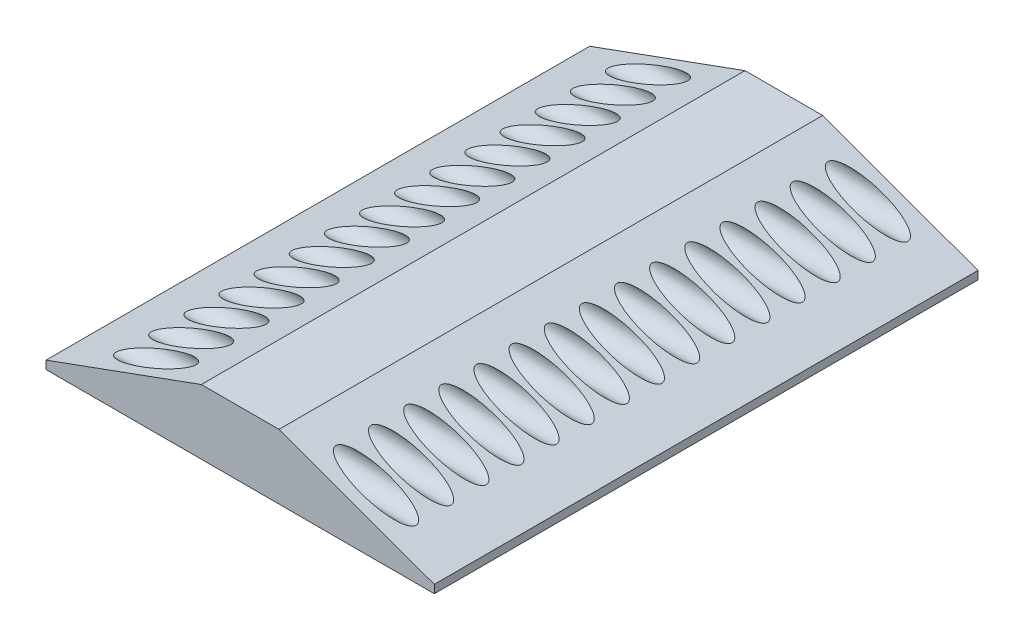
ISO-10303-21;
HEADER;
FILE_DESCRIPTION(('STEP AP214'),'2;1');
FILE_NAME('part.step','',(''),(''),'','','');
FILE_SCHEMA(('AUTOMOTIVE_DESIGN { 1 0 10303 214 1 1 1 1 }'));
ENDSEC;
DATA;
#1=APPLICATION_CONTEXT('core data for automotive mechanical design processes');
#2=APPLICATION_PROTOCOL_DEFINITION('international standard','automotive_design',2000,#1);
#3=PRODUCT_CONTEXT('',#1,'mechanical');
#4=PRODUCT('Part','Part','',(#3));
#5=PRODUCT_RELATED_PRODUCT_CATEGORY('part','',(#4));
#6=PRODUCT_DEFINITION_FORMATION('','',#4);
#7=PRODUCT_DEFINITION_CONTEXT('part definition',#1,'design');
#8=PRODUCT_DEFINITION('design','',#6,#7);
#9=PRODUCT_DEFINITION_SHAPE('','',#8);
#10=(LENGTH_UNIT() NAMED_UNIT(*) SI_UNIT(.MILLI.,.METRE.));
#11=(NAMED_UNIT(*) PLANE_ANGLE_UNIT() SI_UNIT($,.RADIAN.));
#12=(NAMED_UNIT(*) SI_UNIT($,.STERADIAN.) SOLID_ANGLE_UNIT());
#13=UNCERTAINTY_MEASURE_WITH_UNIT(LENGTH_MEASURE(1.E-05),#10,'distance_accuracy_value','');
#14=(GEOMETRIC_REPRESENTATION_CONTEXT(3) GLOBAL_UNCERTAINTY_ASSIGNED_CONTEXT((#13)) GLOBAL_UNIT_ASSIGNED_CONTEXT((#10,
#11,#12)) REPRESENTATION_CONTEXT('',''));
#15=CARTESIAN_POINT('',(0.,0.,0.));
#16=DIRECTION('',(0.,0.,1.));
#17=DIRECTION('',(1.,0.,0.));
#18=AXIS2_PLACEMENT_3D('',#15,#16,#17);
#19=CARTESIAN_POINT('',(15.,5.,21.));
#20=DIRECTION('',(-1.,0.,0.));
#21=DIRECTION('',(0.,0.,1.));
#22=AXIS2_PLACEMENT_3D('',#19,#20,#21);
#23=PLANE('',#22);
#24=DIRECTION('',(0.,-1.,0.));
#25=VECTOR('',#24,1.);
#26=CARTESIAN_POINT('',(15.,5.,-21.));
#27=LINE('',#26,#25);
#28=CARTESIAN_POINT('',(15.,0.632357188805568,-21.));
#29=VERTEX_POINT('',#28);
#30=CARTESIAN_POINT('',(15.,0.,-21.));
#31=VERTEX_POINT('',#30);
#32=EDGE_CURVE('E86',#29,#31,#27,.T.);
#33=ORIENTED_EDGE('',*,*,#32,.F.);
#34=DIRECTION('',(0.,0.,1.));
#35=VECTOR('',#34,1.);
#36=CARTESIAN_POINT('',(15.,0.632357188805568,21.));
#37=LINE('',#36,#35);
#38=CARTESIAN_POINT('',(15.,0.632357188805568,21.));
#39=VERTEX_POINT('',#38);
#40=EDGE_CURVE('E128',#29,#39,#37,.T.);
#41=ORIENTED_EDGE('',*,*,#40,.T.);
#42=DIRECTION('',(0.,-1.,0.));
#43=VECTOR('',#42,1.);
#44=CARTESIAN_POINT('',(15.,5.,21.));
#45=LINE('',#44,#43);
#46=CARTESIAN_POINT('',(15.,0.,21.));
#47=VERTEX_POINT('',#46);
#48=EDGE_CURVE('E108',#39,#47,#45,.T.);
#49=ORIENTED_EDGE('',*,*,#48,.T.);
#50=DIRECTION('',(0.,0.,-1.));
#51=VECTOR('',#50,1.);
#52=CARTESIAN_POINT('',(15.,0.,21.));
#53=LINE('',#52,#51);
#54=EDGE_CURVE('E103',#47,#31,#53,.T.);
#55=ORIENTED_EDGE('',*,*,#54,.T.);
#56=EDGE_LOOP('',(#33,#41,#49,#55));
#57=FACE_BOUND('',#56,.T.);
#58=ADVANCED_FACE('F33',(#57),#23,.F.);
#59=CARTESIAN_POINT('',(-15.,5.,-21.));
#60=DIRECTION('',(0.,0.,1.));
#61=DIRECTION('',(1.,0.,0.));
#62=AXIS2_PLACEMENT_3D('',#59,#60,#61);
#63=PLANE('',#62);
#64=DIRECTION('',(0.,-1.,0.));
#65=VECTOR('',#64,1.);
#66=CARTESIAN_POINT('',(-15.,5.,-21.));
#67=LINE('',#66,#65);
#68=CARTESIAN_POINT('',(-15.,0.632357188805568,-21.));
#69=VERTEX_POINT('',#68);
#70=CARTESIAN_POINT('',(-15.,0.,-21.));
#71=VERTEX_POINT('',#70);
#72=EDGE_CURVE('E97',#69,#71,#67,.T.);
#73=ORIENTED_EDGE('',*,*,#72,.F.);
#74=DIRECTION('',(-0.939692620785909,-0.342020143325666,0.));
#75=VECTOR('',#74,1.);
#76=CARTESIAN_POINT('',(-2.99999999999991,5.,-21.));
#77=LINE('',#76,#75);
#78=CARTESIAN_POINT('',(-2.99999999999991,5.,-21.));
#79=VERTEX_POINT('',#78);
#80=EDGE_CURVE('E11',#69,#79,#77,.F.);
#81=ORIENTED_EDGE('',*,*,#80,.T.);
#82=DIRECTION('',(-1.,0.,0.));
#83=VECTOR('',#82,1.);
#84=CARTESIAN_POINT('',(-15.,5.,-21.));
#85=LINE('',#84,#83);
#86=CARTESIAN_POINT('',(2.99999999999988,5.,-21.));
#87=VERTEX_POINT('',#86);
#88=EDGE_CURVE('E120',#87,#79,#85,.T.);
#89=ORIENTED_EDGE('',*,*,#88,.F.);
#90=DIRECTION('',(-0.939692620785909,0.342020143325666,0.));
#91=VECTOR('',#90,1.);
#92=CARTESIAN_POINT('',(2.99999999999988,5.,-21.));
#93=LINE('',#92,#91);
#94=EDGE_CURVE('E92',#87,#29,#93,.F.);
#95=ORIENTED_EDGE('',*,*,#94,.T.);
#96=ORIENTED_EDGE('',*,*,#32,.T.);
#97=DIRECTION('',(-1.,0.,0.));
#98=VECTOR('',#97,1.);
#99=CARTESIAN_POINT('',(-15.,0.,-21.));
#100=LINE('',#99,#98);
#101=EDGE_CURVE('E89',#31,#71,#100,.T.);
#102=ORIENTED_EDGE('',*,*,#101,.T.);
#103=EDGE_LOOP('',(#73,#81,#89,#95,#96,#102));
#104=FACE_BOUND('',#103,.T.);
#105=ADVANCED_FACE('F88',(#104),#63,.F.);
#106=CARTESIAN_POINT('',(-15.,5.,21.));
#107=DIRECTION('',(1.,0.,0.));
#108=DIRECTION('',(0.,0.,-1.));
#109=AXIS2_PLACEMENT_3D('',#106,#107,#108);
#110=PLANE('',#109);
#111=DIRECTION('',(0.,-1.,0.));
#112=VECTOR('',#111,1.);
#113=CARTESIAN_POINT('',(-15.,5.,21.));
#114=LINE('',#113,#112);
#115=CARTESIAN_POINT('',(-15.,0.632357188805568,21.));
#116=VERTEX_POINT('',#115);
#117=CARTESIAN_POINT('',(-15.,0.,21.));
#118=VERTEX_POINT('',#117);
#119=EDGE_CURVE('E122',#116,#118,#114,.T.);
#120=ORIENTED_EDGE('',*,*,#119,.F.);
#121=DIRECTION('',(0.,0.,-1.));
#122=VECTOR('',#121,1.);
#123=CARTESIAN_POINT('',(-15.,0.632357188805568,21.));
#124=LINE('',#123,#122);
#125=EDGE_CURVE('E42',#116,#69,#124,.T.);
#126=ORIENTED_EDGE('',*,*,#125,.T.);
#127=ORIENTED_EDGE('',*,*,#72,.T.);
#128=DIRECTION('',(0.,0.,1.));
#129=VECTOR('',#128,1.);
#130=CARTESIAN_POINT('',(-15.,0.,21.));
#131=LINE('',#130,#129);
#132=EDGE_CURVE('E105',#71,#118,#131,.T.);
#133=ORIENTED_EDGE('',*,*,#132,.T.);
#134=EDGE_LOOP('',(#120,#126,#127,#133));
#135=FACE_BOUND('',#134,.T.);
#136=ADVANCED_FACE('F251',(#135),#110,.F.);
#137=CARTESIAN_POINT('',(-15.,5.,21.));
#138=DIRECTION('',(0.,0.,-1.));
#139=DIRECTION('',(-1.,0.,0.));
#140=AXIS2_PLACEMENT_3D('',#137,#138,#139);
#141=PLANE('',#140);
#142=DIRECTION('',(1.,0.,0.));
#143=VECTOR('',#142,1.);
#144=CARTESIAN_POINT('',(-15.,5.,21.));
#145=LINE('',#144,#143);
#146=CARTESIAN_POINT('',(-2.99999999999991,5.,21.));
#147=VERTEX_POINT('',#146);
#148=CARTESIAN_POINT('',(2.99999999999988,5.,21.));
#149=VERTEX_POINT('',#148);
#150=EDGE_CURVE('E114',#147,#149,#145,.T.);
#151=ORIENTED_EDGE('',*,*,#150,.F.);
#152=DIRECTION('',(0.939692620785909,0.342020143325666,0.));
#153=VECTOR('',#152,1.);
#154=CARTESIAN_POINT('',(-2.99999999999991,5.,21.));
#155=LINE('',#154,#153);
#156=EDGE_CURVE('E57',#147,#116,#155,.F.);
#157=ORIENTED_EDGE('',*,*,#156,.T.);
#158=ORIENTED_EDGE('',*,*,#119,.T.);
#159=DIRECTION('',(1.,0.,0.));
#160=VECTOR('',#159,1.);
#161=CARTESIAN_POINT('',(-15.,0.,21.));
#162=LINE('',#161,#160);
#163=EDGE_CURVE('E118',#118,#47,#162,.T.);
#164=ORIENTED_EDGE('',*,*,#163,.T.);
#165=ORIENTED_EDGE('',*,*,#48,.F.);
#166=DIRECTION('',(0.939692620785909,-0.342020143325666,0.));
#167=VECTOR('',#166,1.);
#168=CARTESIAN_POINT('',(2.99999999999988,5.,21.));
#169=LINE('',#168,#167);
#170=EDGE_CURVE('E130',#39,#149,#169,.F.);
#171=ORIENTED_EDGE('',*,*,#170,.T.);
#172=EDGE_LOOP('',(#151,#157,#158,#164,#165,#171));
#173=FACE_BOUND('',#172,.T.);
#174=ADVANCED_FACE('F256',(#173),#141,.F.);
#175=CARTESIAN_POINT('',(0.,5.,0.));
#176=DIRECTION('',(0.,-1.,0.));
#177=DIRECTION('',(0.,0.,-1.));
#178=AXIS2_PLACEMENT_3D('',#175,#176,#177);
#179=PLANE('',#178);
#180=ORIENTED_EDGE('',*,*,#88,.T.);
#181=DIRECTION('',(0.,0.,1.));
#182=VECTOR('',#181,1.);
#183=CARTESIAN_POINT('',(-2.99999999999991,5.,0.));
#184=LINE('',#183,#182);
#185=EDGE_CURVE('E133',#79,#147,#184,.T.);
#186=ORIENTED_EDGE('',*,*,#185,.T.);
#187=ORIENTED_EDGE('',*,*,#150,.T.);
#188=DIRECTION('',(0.,0.,-1.));
#189=VECTOR('',#188,1.);
#190=CARTESIAN_POINT('',(2.99999999999988,5.,0.));
#191=LINE('',#190,#189);
#192=EDGE_CURVE('E96',#149,#87,#191,.T.);
#193=ORIENTED_EDGE('',*,*,#192,.T.);
#194=EDGE_LOOP('',(#180,#186,#187,#193));
#195=FACE_BOUND('',#194,.T.);
#196=ADVANCED_FACE('F259',(#195),#179,.F.);
#197=CARTESIAN_POINT('',(0.,0.,0.));
#198=DIRECTION('',(0.,-1.,0.));
#199=DIRECTION('',(0.,0.,-1.));
#200=AXIS2_PLACEMENT_3D('',#197,#198,#199);
#201=PLANE('',#200);
#202=ORIENTED_EDGE('',*,*,#54,.F.);
#203=ORIENTED_EDGE('',*,*,#163,.F.);
#204=ORIENTED_EDGE('',*,*,#132,.F.);
#205=ORIENTED_EDGE('',*,*,#101,.F.);
#206=EDGE_LOOP('',(#202,#203,#204,#205));
#207=FACE_BOUND('',#206,.T.);
#208=ADVANCED_FACE('F101',(#207),#201,.T.);
#209=CARTESIAN_POINT('',(-15.,3.,-19.));
#210=DIRECTION('',(1.,0.,0.));
#211=DIRECTION('',(0.,0.,-1.));
#212=AXIS2_PLACEMENT_3D('',#209,#210,#211);
#213=CYLINDRICAL_SURFACE('',#212,1.125);
#214=CARTESIAN_POINT('',(-8.49495483890919,3.,-19.));
#215=DIRECTION('',(0.342020143325666,-0.939692620785909,0.));
#216=DIRECTION('',(0.939692620785909,0.342020143325666,0.));
#217=AXIS2_PLACEMENT_3D('',#214,#215,#216);
#218=ELLIPSE('',#217,3.2892799501835,1.125);
#219=CARTESIAN_POINT('',(-5.40404274202272,4.125,-19.));
#220=VERTEX_POINT('',#219);
#221=EDGE_CURVE('E137',#220,#220,#218,.T.);
#222=ORIENTED_EDGE('',*,*,#221,.F.);
#223=EDGE_LOOP('',(#222));
#224=FACE_BOUND('',#223,.T.);
#225=CARTESIAN_POINT('',(8.49495483890916,3.,-19.));
#226=DIRECTION('',(-0.342020143325666,-0.939692620785909,0.));
#227=DIRECTION('',(0.939692620785909,-0.342020143325666,0.));
#228=AXIS2_PLACEMENT_3D('',#225,#226,#227);
#229=ELLIPSE('',#228,3.2892799501835,1.125);
#230=CARTESIAN_POINT('',(11.5858669357956,1.875,-19.));
#231=VERTEX_POINT('',#230);
#232=EDGE_CURVE('E134',#231,#231,#229,.F.);
#233=ORIENTED_EDGE('',*,*,#232,.T.);
#234=EDGE_LOOP('',(#233));
#235=FACE_BOUND('',#234,.T.);
#236=ADVANCED_FACE('F262',(#224,#235),#213,.F.);
#237=CARTESIAN_POINT('',(-15.,3.,-16.2857142857143));
#238=DIRECTION('',(1.,0.,0.));
#239=DIRECTION('',(0.,0.,-1.));
#240=AXIS2_PLACEMENT_3D('',#237,#238,#239);
#241=CYLINDRICAL_SURFACE('',#240,1.125);
#242=CARTESIAN_POINT('',(-8.49495483890919,3.,-16.2857142857143));
#243=DIRECTION('',(0.342020143325666,-0.939692620785909,0.));
#244=DIRECTION('',(0.939692620785909,0.342020143325666,0.));
#245=AXIS2_PLACEMENT_3D('',#242,#243,#244);
#246=ELLIPSE('',#245,3.2892799501835,1.125);
#247=CARTESIAN_POINT('',(-5.40404274202272,4.125,-16.2857142857143));
#248=VERTEX_POINT('',#247);
#249=EDGE_CURVE('E141',#248,#248,#246,.T.);
#250=ORIENTED_EDGE('',*,*,#249,.F.);
#251=EDGE_LOOP('',(#250));
#252=FACE_BOUND('',#251,.T.);
#253=CARTESIAN_POINT('',(8.49495483890916,3.,-16.2857142857143));
#254=DIRECTION('',(-0.342020143325666,-0.939692620785909,0.));
#255=DIRECTION('',(0.939692620785909,-0.342020143325666,0.));
#256=AXIS2_PLACEMENT_3D('',#253,#254,#255);
#257=ELLIPSE('',#256,3.2892799501835,1.125);
#258=CARTESIAN_POINT('',(11.5858669357956,1.875,-16.2857142857143));
#259=VERTEX_POINT('',#258);
#260=EDGE_CURVE('E138',#259,#259,#257,.F.);
#261=ORIENTED_EDGE('',*,*,#260,.T.);
#262=EDGE_LOOP('',(#261));
#263=FACE_BOUND('',#262,.T.);
#264=ADVANCED_FACE('F268',(#252,#263),#241,.F.);
#265=CARTESIAN_POINT('',(-15.,3.,-13.5714285714286));
#266=DIRECTION('',(1.,0.,0.));
#267=DIRECTION('',(0.,0.,-1.));
#268=AXIS2_PLACEMENT_3D('',#265,#266,#267);
#269=CYLINDRICAL_SURFACE('',#268,1.125);
#270=CARTESIAN_POINT('',(-8.49495483890919,3.,-13.5714285714286));
#271=DIRECTION('',(0.342020143325666,-0.939692620785909,0.));
#272=DIRECTION('',(0.939692620785909,0.342020143325666,0.));
#273=AXIS2_PLACEMENT_3D('',#270,#271,#272);
#274=ELLIPSE('',#273,3.28927995018349,1.125);
#275=CARTESIAN_POINT('',(-5.40404274202272,4.125,-13.5714285714286));
#276=VERTEX_POINT('',#275);
#277=EDGE_CURVE('E145',#276,#276,#274,.T.);
#278=ORIENTED_EDGE('',*,*,#277,.F.);
#279=EDGE_LOOP('',(#278));
#280=FACE_BOUND('',#279,.T.);
#281=CARTESIAN_POINT('',(8.49495483890916,3.,-13.5714285714286));
#282=DIRECTION('',(-0.342020143325666,-0.939692620785909,0.));
#283=DIRECTION('',(0.939692620785909,-0.342020143325666,0.));
#284=AXIS2_PLACEMENT_3D('',#281,#282,#283);
#285=ELLIPSE('',#284,3.28927995018349,1.125);
#286=CARTESIAN_POINT('',(11.5858669357956,1.875,-13.5714285714286));
#287=VERTEX_POINT('',#286);
#288=EDGE_CURVE('E142',#287,#287,#285,.F.);
#289=ORIENTED_EDGE('',*,*,#288,.T.);
#290=EDGE_LOOP('',(#289));
#291=FACE_BOUND('',#290,.T.);
#292=ADVANCED_FACE('F272',(#280,#291),#269,.F.);
#293=CARTESIAN_POINT('',(-15.,3.,-10.8571428571429));
#294=DIRECTION('',(1.,0.,0.));
#295=DIRECTION('',(0.,0.,-1.));
#296=AXIS2_PLACEMENT_3D('',#293,#294,#295);
#297=CYLINDRICAL_SURFACE('',#296,1.125);
#298=CARTESIAN_POINT('',(-8.49495483890919,3.,-10.8571428571429));
#299=DIRECTION('',(0.342020143325666,-0.939692620785909,0.));
#300=DIRECTION('',(0.939692620785909,0.342020143325666,0.));
#301=AXIS2_PLACEMENT_3D('',#298,#299,#300);
#302=ELLIPSE('',#301,3.28927995018349,1.125);
#303=CARTESIAN_POINT('',(-5.40404274202272,4.125,-10.8571428571429));
#304=VERTEX_POINT('',#303);
#305=EDGE_CURVE('E149',#304,#304,#302,.T.);
#306=ORIENTED_EDGE('',*,*,#305,.F.);
#307=EDGE_LOOP('',(#306));
#308=FACE_BOUND('',#307,.T.);
#309=CARTESIAN_POINT('',(8.49495483890916,3.,-10.8571428571429));
#310=DIRECTION('',(-0.342020143325666,-0.939692620785909,0.));
#311=DIRECTION('',(0.939692620785909,-0.342020143325666,0.));
#312=AXIS2_PLACEMENT_3D('',#309,#310,#311);
#313=ELLIPSE('',#312,3.28927995018349,1.125);
#314=CARTESIAN_POINT('',(11.5858669357956,1.875,-10.8571428571429));
#315=VERTEX_POINT('',#314);
#316=EDGE_CURVE('E146',#315,#315,#313,.F.);
#317=ORIENTED_EDGE('',*,*,#316,.T.);
#318=EDGE_LOOP('',(#317));
#319=FACE_BOUND('',#318,.T.);
#320=ADVANCED_FACE('F276',(#308,#319),#297,.F.);
#321=CARTESIAN_POINT('',(-15.,3.,-8.14285714285715));
#322=DIRECTION('',(1.,0.,0.));
#323=DIRECTION('',(0.,0.,-1.));
#324=AXIS2_PLACEMENT_3D('',#321,#322,#323);
#325=CYLINDRICAL_SURFACE('',#324,1.125);
#326=CARTESIAN_POINT('',(-8.49495483890919,3.,-8.14285714285715));
#327=DIRECTION('',(0.342020143325666,-0.939692620785909,0.));
#328=DIRECTION('',(0.939692620785909,0.342020143325666,0.));
#329=AXIS2_PLACEMENT_3D('',#326,#327,#328);
#330=ELLIPSE('',#329,3.28927995018349,1.125);
#331=CARTESIAN_POINT('',(-5.40404274202272,4.125,-8.14285714285715));
#332=VERTEX_POINT('',#331);
#333=EDGE_CURVE('E153',#332,#332,#330,.T.);
#334=ORIENTED_EDGE('',*,*,#333,.F.);
#335=EDGE_LOOP('',(#334));
#336=FACE_BOUND('',#335,.T.);
#337=CARTESIAN_POINT('',(8.49495483890916,3.,-8.14285714285715));
#338=DIRECTION('',(-0.342020143325666,-0.939692620785909,0.));
#339=DIRECTION('',(0.939692620785909,-0.342020143325666,0.));
#340=AXIS2_PLACEMENT_3D('',#337,#338,#339);
#341=ELLIPSE('',#340,3.28927995018349,1.125);
#342=CARTESIAN_POINT('',(11.5858669357956,1.875,-8.14285714285715));
#343=VERTEX_POINT('',#342);
#344=EDGE_CURVE('E150',#343,#343,#341,.F.);
#345=ORIENTED_EDGE('',*,*,#344,.T.);
#346=EDGE_LOOP('',(#345));
#347=FACE_BOUND('',#346,.T.);
#348=ADVANCED_FACE('F280',(#336,#347),#325,.F.);
#349=CARTESIAN_POINT('',(-15.,3.,-5.42857142857143));
#350=DIRECTION('',(1.,0.,0.));
#351=DIRECTION('',(0.,0.,-1.));
#352=AXIS2_PLACEMENT_3D('',#349,#350,#351);
#353=CYLINDRICAL_SURFACE('',#352,1.125);
#354=CARTESIAN_POINT('',(-8.49495483890919,3.,-5.42857142857143));
#355=DIRECTION('',(0.342020143325666,-0.939692620785909,0.));
#356=DIRECTION('',(0.939692620785909,0.342020143325666,0.));
#357=AXIS2_PLACEMENT_3D('',#354,#355,#356);
#358=ELLIPSE('',#357,3.2892799501835,1.125);
#359=CARTESIAN_POINT('',(-5.40404274202272,4.125,-5.42857142857143));
#360=VERTEX_POINT('',#359);
#361=EDGE_CURVE('E157',#360,#360,#358,.T.);
#362=ORIENTED_EDGE('',*,*,#361,.F.);
#363=EDGE_LOOP('',(#362));
#364=FACE_BOUND('',#363,.T.);
#365=CARTESIAN_POINT('',(8.49495483890916,3.,-5.42857142857143));
#366=DIRECTION('',(-0.342020143325666,-0.939692620785909,0.));
#367=DIRECTION('',(0.939692620785909,-0.342020143325666,0.));
#368=AXIS2_PLACEMENT_3D('',#365,#366,#367);
#369=ELLIPSE('',#368,3.2892799501835,1.125);
#370=CARTESIAN_POINT('',(11.5858669357956,1.875,-5.42857142857143));
#371=VERTEX_POINT('',#370);
#372=EDGE_CURVE('E154',#371,#371,#369,.F.);
#373=ORIENTED_EDGE('',*,*,#372,.T.);
#374=EDGE_LOOP('',(#373));
#375=FACE_BOUND('',#374,.T.);
#376=ADVANCED_FACE('F284',(#364,#375),#353,.F.);
#377=CARTESIAN_POINT('',(-15.,3.,-2.71428571428572));
#378=DIRECTION('',(1.,0.,0.));
#379=DIRECTION('',(0.,0.,-1.));
#380=AXIS2_PLACEMENT_3D('',#377,#378,#379);
#381=CYLINDRICAL_SURFACE('',#380,1.125);
#382=CARTESIAN_POINT('',(-8.49495483890919,3.,-2.71428571428572));
#383=DIRECTION('',(0.342020143325666,-0.939692620785909,0.));
#384=DIRECTION('',(0.939692620785909,0.342020143325666,0.));
#385=AXIS2_PLACEMENT_3D('',#382,#383,#384);
#386=ELLIPSE('',#385,3.2892799501835,1.125);
#387=CARTESIAN_POINT('',(-5.40404274202272,4.125,-2.71428571428572));
#388=VERTEX_POINT('',#387);
#389=EDGE_CURVE('E161',#388,#388,#386,.T.);
#390=ORIENTED_EDGE('',*,*,#389,.F.);
#391=EDGE_LOOP('',(#390));
#392=FACE_BOUND('',#391,.T.);
#393=CARTESIAN_POINT('',(8.49495483890916,3.,-2.71428571428572));
#394=DIRECTION('',(-0.342020143325666,-0.939692620785909,0.));
#395=DIRECTION('',(0.939692620785909,-0.342020143325666,0.));
#396=AXIS2_PLACEMENT_3D('',#393,#394,#395);
#397=ELLIPSE('',#396,3.2892799501835,1.125);
#398=CARTESIAN_POINT('',(11.5858669357956,1.875,-2.71428571428572));
#399=VERTEX_POINT('',#398);
#400=EDGE_CURVE('E158',#399,#399,#397,.F.);
#401=ORIENTED_EDGE('',*,*,#400,.T.);
#402=EDGE_LOOP('',(#401));
#403=FACE_BOUND('',#402,.T.);
#404=ADVANCED_FACE('F288',(#392,#403),#381,.F.);
#405=CARTESIAN_POINT('',(-15.,3.,0.));
#406=DIRECTION('',(1.,0.,0.));
#407=DIRECTION('',(0.,0.,-1.));
#408=AXIS2_PLACEMENT_3D('',#405,#406,#407);
#409=CYLINDRICAL_SURFACE('',#408,1.125);
#410=CARTESIAN_POINT('',(-8.49495483890919,3.,0.));
#411=DIRECTION('',(0.342020143325666,-0.939692620785909,0.));
#412=DIRECTION('',(0.939692620785909,0.342020143325666,0.));
#413=AXIS2_PLACEMENT_3D('',#410,#411,#412);
#414=ELLIPSE('',#413,3.2892799501835,1.125);
#415=CARTESIAN_POINT('',(-5.40404274202272,4.125,0.));
#416=VERTEX_POINT('',#415);
#417=EDGE_CURVE('E165',#416,#416,#414,.T.);
#418=ORIENTED_EDGE('',*,*,#417,.F.);
#419=EDGE_LOOP('',(#418));
#420=FACE_BOUND('',#419,.T.);
#421=CARTESIAN_POINT('',(8.49495483890916,3.,0.));
#422=DIRECTION('',(-0.342020143325666,-0.939692620785909,0.));
#423=DIRECTION('',(0.939692620785909,-0.342020143325666,0.));
#424=AXIS2_PLACEMENT_3D('',#421,#422,#423);
#425=ELLIPSE('',#424,3.2892799501835,1.125);
#426=CARTESIAN_POINT('',(11.5858669357956,1.875,0.));
#427=VERTEX_POINT('',#426);
#428=EDGE_CURVE('E162',#427,#427,#425,.F.);
#429=ORIENTED_EDGE('',*,*,#428,.T.);
#430=EDGE_LOOP('',(#429));
#431=FACE_BOUND('',#430,.T.);
#432=ADVANCED_FACE('F292',(#420,#431),#409,.F.);
#433=CARTESIAN_POINT('',(-15.,3.,2.71428571428571));
#434=DIRECTION('',(1.,0.,0.));
#435=DIRECTION('',(0.,0.,-1.));
#436=AXIS2_PLACEMENT_3D('',#433,#434,#435);
#437=CYLINDRICAL_SURFACE('',#436,1.125);
#438=CARTESIAN_POINT('',(-8.49495483890919,3.,2.71428571428571));
#439=DIRECTION('',(0.342020143325666,-0.939692620785909,0.));
#440=DIRECTION('',(0.939692620785909,0.342020143325666,0.));
#441=AXIS2_PLACEMENT_3D('',#438,#439,#440);
#442=ELLIPSE('',#441,3.2892799501835,1.125);
#443=CARTESIAN_POINT('',(-5.40404274202272,4.125,2.71428571428571));
#444=VERTEX_POINT('',#443);
#445=EDGE_CURVE('E169',#444,#444,#442,.T.);
#446=ORIENTED_EDGE('',*,*,#445,.F.);
#447=EDGE_LOOP('',(#446));
#448=FACE_BOUND('',#447,.T.);
#449=CARTESIAN_POINT('',(8.49495483890916,3.,2.71428571428571));
#450=DIRECTION('',(-0.342020143325666,-0.939692620785909,0.));
#451=DIRECTION('',(0.939692620785909,-0.342020143325666,0.));
#452=AXIS2_PLACEMENT_3D('',#449,#450,#451);
#453=ELLIPSE('',#452,3.2892799501835,1.125);
#454=CARTESIAN_POINT('',(11.5858669357956,1.875,2.71428571428571));
#455=VERTEX_POINT('',#454);
#456=EDGE_CURVE('E166',#455,#455,#453,.F.);
#457=ORIENTED_EDGE('',*,*,#456,.T.);
#458=EDGE_LOOP('',(#457));
#459=FACE_BOUND('',#458,.T.);
#460=ADVANCED_FACE('F296',(#448,#459),#437,.F.);
#461=CARTESIAN_POINT('',(-15.,3.,5.42857142857143));
#462=DIRECTION('',(1.,0.,0.));
#463=DIRECTION('',(0.,0.,-1.));
#464=AXIS2_PLACEMENT_3D('',#461,#462,#463);
#465=CYLINDRICAL_SURFACE('',#464,1.125);
#466=CARTESIAN_POINT('',(-8.49495483890919,3.,5.42857142857143));
#467=DIRECTION('',(0.342020143325666,-0.939692620785909,0.));
#468=DIRECTION('',(0.939692620785909,0.342020143325666,0.));
#469=AXIS2_PLACEMENT_3D('',#466,#467,#468);
#470=ELLIPSE('',#469,3.2892799501835,1.125);
#471=CARTESIAN_POINT('',(-5.40404274202272,4.125,5.42857142857143));
#472=VERTEX_POINT('',#471);
#473=EDGE_CURVE('E173',#472,#472,#470,.T.);
#474=ORIENTED_EDGE('',*,*,#473,.F.);
#475=EDGE_LOOP('',(#474));
#476=FACE_BOUND('',#475,.T.);
#477=CARTESIAN_POINT('',(8.49495483890916,3.,5.42857142857143));
#478=DIRECTION('',(-0.342020143325666,-0.939692620785909,0.));
#479=DIRECTION('',(0.939692620785909,-0.342020143325666,0.));
#480=AXIS2_PLACEMENT_3D('',#477,#478,#479);
#481=ELLIPSE('',#480,3.2892799501835,1.125);
#482=CARTESIAN_POINT('',(11.5858669357956,1.875,5.42857142857143));
#483=VERTEX_POINT('',#482);
#484=EDGE_CURVE('E170',#483,#483,#481,.F.);
#485=ORIENTED_EDGE('',*,*,#484,.T.);
#486=EDGE_LOOP('',(#485));
#487=FACE_BOUND('',#486,.T.);
#488=ADVANCED_FACE('F300',(#476,#487),#465,.F.);
#489=CARTESIAN_POINT('',(-15.,3.,8.14285714285714));
#490=DIRECTION('',(1.,0.,0.));
#491=DIRECTION('',(0.,0.,-1.));
#492=AXIS2_PLACEMENT_3D('',#489,#490,#491);
#493=CYLINDRICAL_SURFACE('',#492,1.125);
#494=CARTESIAN_POINT('',(-8.49495483890919,3.,8.14285714285714));
#495=DIRECTION('',(0.342020143325666,-0.939692620785909,0.));
#496=DIRECTION('',(0.939692620785909,0.342020143325666,0.));
#497=AXIS2_PLACEMENT_3D('',#494,#495,#496);
#498=ELLIPSE('',#497,3.2892799501835,1.125);
#499=CARTESIAN_POINT('',(-5.40404274202272,4.125,8.14285714285714));
#500=VERTEX_POINT('',#499);
#501=EDGE_CURVE('E177',#500,#500,#498,.T.);
#502=ORIENTED_EDGE('',*,*,#501,.F.);
#503=EDGE_LOOP('',(#502));
#504=FACE_BOUND('',#503,.T.);
#505=CARTESIAN_POINT('',(8.49495483890916,3.,8.14285714285714));
#506=DIRECTION('',(-0.342020143325666,-0.939692620785909,0.));
#507=DIRECTION('',(0.939692620785909,-0.342020143325666,0.));
#508=AXIS2_PLACEMENT_3D('',#505,#506,#507);
#509=ELLIPSE('',#508,3.2892799501835,1.125);
#510=CARTESIAN_POINT('',(11.5858669357956,1.875,8.14285714285714));
#511=VERTEX_POINT('',#510);
#512=EDGE_CURVE('E174',#511,#511,#509,.F.);
#513=ORIENTED_EDGE('',*,*,#512,.T.);
#514=EDGE_LOOP('',(#513));
#515=FACE_BOUND('',#514,.T.);
#516=ADVANCED_FACE('F304',(#504,#515),#493,.F.);
#517=CARTESIAN_POINT('',(-15.,3.,10.8571428571429));
#518=DIRECTION('',(1.,0.,0.));
#519=DIRECTION('',(0.,0.,-1.));
#520=AXIS2_PLACEMENT_3D('',#517,#518,#519);
#521=CYLINDRICAL_SURFACE('',#520,1.125);
#522=CARTESIAN_POINT('',(-8.49495483890919,3.,10.8571428571429));
#523=DIRECTION('',(0.342020143325666,-0.939692620785909,0.));
#524=DIRECTION('',(0.939692620785909,0.342020143325666,0.));
#525=AXIS2_PLACEMENT_3D('',#522,#523,#524);
#526=ELLIPSE('',#525,3.28927995018349,1.125);
#527=CARTESIAN_POINT('',(-5.40404274202272,4.125,10.8571428571429));
#528=VERTEX_POINT('',#527);
#529=EDGE_CURVE('E181',#528,#528,#526,.T.);
#530=ORIENTED_EDGE('',*,*,#529,.F.);
#531=EDGE_LOOP('',(#530));
#532=FACE_BOUND('',#531,.T.);
#533=CARTESIAN_POINT('',(8.49495483890916,3.,10.8571428571429));
#534=DIRECTION('',(-0.342020143325666,-0.939692620785909,0.));
#535=DIRECTION('',(0.939692620785909,-0.342020143325666,0.));
#536=AXIS2_PLACEMENT_3D('',#533,#534,#535);
#537=ELLIPSE('',#536,3.28927995018349,1.125);
#538=CARTESIAN_POINT('',(11.5858669357956,1.875,10.8571428571429));
#539=VERTEX_POINT('',#538);
#540=EDGE_CURVE('E178',#539,#539,#537,.F.);
#541=ORIENTED_EDGE('',*,*,#540,.T.);
#542=EDGE_LOOP('',(#541));
#543=FACE_BOUND('',#542,.T.);
#544=ADVANCED_FACE('F308',(#532,#543),#521,.F.);
#545=CARTESIAN_POINT('',(-15.,3.,13.5714285714286));
#546=DIRECTION('',(1.,0.,0.));
#547=DIRECTION('',(0.,0.,-1.));
#548=AXIS2_PLACEMENT_3D('',#545,#546,#547);
#549=CYLINDRICAL_SURFACE('',#548,1.125);
#550=CARTESIAN_POINT('',(-8.49495483890919,3.,13.5714285714286));
#551=DIRECTION('',(0.342020143325666,-0.939692620785909,0.));
#552=DIRECTION('',(0.939692620785909,0.342020143325666,0.));
#553=AXIS2_PLACEMENT_3D('',#550,#551,#552);
#554=ELLIPSE('',#553,3.28927995018349,1.125);
#555=CARTESIAN_POINT('',(-5.40404274202272,4.125,13.5714285714286));
#556=VERTEX_POINT('',#555);
#557=EDGE_CURVE('E185',#556,#556,#554,.T.);
#558=ORIENTED_EDGE('',*,*,#557,.F.);
#559=EDGE_LOOP('',(#558));
#560=FACE_BOUND('',#559,.T.);
#561=CARTESIAN_POINT('',(8.49495483890916,3.,13.5714285714286));
#562=DIRECTION('',(-0.342020143325666,-0.939692620785909,0.));
#563=DIRECTION('',(0.939692620785909,-0.342020143325666,0.));
#564=AXIS2_PLACEMENT_3D('',#561,#562,#563);
#565=ELLIPSE('',#564,3.28927995018349,1.125);
#566=CARTESIAN_POINT('',(11.5858669357956,1.875,13.5714285714286));
#567=VERTEX_POINT('',#566);
#568=EDGE_CURVE('E182',#567,#567,#565,.F.);
#569=ORIENTED_EDGE('',*,*,#568,.T.);
#570=EDGE_LOOP('',(#569));
#571=FACE_BOUND('',#570,.T.);
#572=ADVANCED_FACE('F230',(#560,#571),#549,.F.);
#573=CARTESIAN_POINT('',(-15.,3.,16.2857142857143));
#574=DIRECTION('',(1.,0.,0.));
#575=DIRECTION('',(0.,0.,-1.));
#576=AXIS2_PLACEMENT_3D('',#573,#574,#575);
#577=CYLINDRICAL_SURFACE('',#576,1.125);
#578=CARTESIAN_POINT('',(-8.49495483890919,3.,16.2857142857143));
#579=DIRECTION('',(0.342020143325666,-0.939692620785909,0.));
#580=DIRECTION('',(0.939692620785909,0.342020143325666,0.));
#581=AXIS2_PLACEMENT_3D('',#578,#579,#580);
#582=ELLIPSE('',#581,3.28927995018349,1.125);
#583=CARTESIAN_POINT('',(-5.40404274202272,4.125,16.2857142857143));
#584=VERTEX_POINT('',#583);
#585=EDGE_CURVE('E189',#584,#584,#582,.T.);
#586=ORIENTED_EDGE('',*,*,#585,.F.);
#587=EDGE_LOOP('',(#586));
#588=FACE_BOUND('',#587,.T.);
#589=CARTESIAN_POINT('',(8.49495483890916,3.,16.2857142857143));
#590=DIRECTION('',(-0.342020143325666,-0.939692620785909,0.));
#591=DIRECTION('',(0.939692620785909,-0.342020143325666,0.));
#592=AXIS2_PLACEMENT_3D('',#589,#590,#591);
#593=ELLIPSE('',#592,3.28927995018349,1.125);
#594=CARTESIAN_POINT('',(11.5858669357956,1.875,16.2857142857143));
#595=VERTEX_POINT('',#594);
#596=EDGE_CURVE('E186',#595,#595,#593,.F.);
#597=ORIENTED_EDGE('',*,*,#596,.T.);
#598=EDGE_LOOP('',(#597));
#599=FACE_BOUND('',#598,.T.);
#600=ADVANCED_FACE('F226',(#588,#599),#577,.F.);
#601=CARTESIAN_POINT('',(-15.,3.,19.));
#602=DIRECTION('',(1.,0.,0.));
#603=DIRECTION('',(0.,0.,-1.));
#604=AXIS2_PLACEMENT_3D('',#601,#602,#603);
#605=CYLINDRICAL_SURFACE('',#604,1.125);
#606=CARTESIAN_POINT('',(-8.49495483890919,3.,19.));
#607=DIRECTION('',(0.342020143325666,-0.939692620785909,0.));
#608=DIRECTION('',(0.939692620785909,0.342020143325666,0.));
#609=AXIS2_PLACEMENT_3D('',#606,#607,#608);
#610=ELLIPSE('',#609,3.2892799501835,1.125);
#611=CARTESIAN_POINT('',(-5.40404274202272,4.125,19.));
#612=VERTEX_POINT('',#611);
#613=EDGE_CURVE('E37',#612,#612,#610,.T.);
#614=ORIENTED_EDGE('',*,*,#613,.F.);
#615=EDGE_LOOP('',(#614));
#616=FACE_BOUND('',#615,.T.);
#617=CARTESIAN_POINT('',(8.49495483890916,3.,19.));
#618=DIRECTION('',(-0.342020143325666,-0.939692620785909,0.));
#619=DIRECTION('',(0.939692620785909,-0.342020143325666,0.));
#620=AXIS2_PLACEMENT_3D('',#617,#618,#619);
#621=ELLIPSE('',#620,3.2892799501835,1.125);
#622=CARTESIAN_POINT('',(11.5858669357956,1.875,19.));
#623=VERTEX_POINT('',#622);
#624=EDGE_CURVE('E112',#623,#623,#621,.F.);
#625=ORIENTED_EDGE('',*,*,#624,.T.);
#626=EDGE_LOOP('',(#625));
#627=FACE_BOUND('',#626,.T.);
#628=ADVANCED_FACE('F229',(#616,#627),#605,.F.);
#629=CARTESIAN_POINT('',(2.99999999999988,5.,0.));
#630=DIRECTION('',(-0.342020143325666,-0.939692620785909,0.));
#631=DIRECTION('',(0.,0.,-1.));
#632=AXIS2_PLACEMENT_3D('',#629,#630,#631);
#633=PLANE('',#632);
#634=ORIENTED_EDGE('',*,*,#170,.F.);
#635=ORIENTED_EDGE('',*,*,#40,.F.);
#636=ORIENTED_EDGE('',*,*,#94,.F.);
#637=ORIENTED_EDGE('',*,*,#192,.F.);
#638=EDGE_LOOP('',(#634,#635,#636,#637));
#639=FACE_BOUND('',#638,.T.);
#640=ORIENTED_EDGE('',*,*,#232,.F.);
#641=EDGE_LOOP('',(#640));
#642=FACE_BOUND('',#641,.T.);
#643=ORIENTED_EDGE('',*,*,#260,.F.);
#644=EDGE_LOOP('',(#643));
#645=FACE_BOUND('',#644,.T.);
#646=ORIENTED_EDGE('',*,*,#288,.F.);
#647=EDGE_LOOP('',(#646));
#648=FACE_BOUND('',#647,.T.);
#649=ORIENTED_EDGE('',*,*,#316,.F.);
#650=EDGE_LOOP('',(#649));
#651=FACE_BOUND('',#650,.T.);
#652=ORIENTED_EDGE('',*,*,#344,.F.);
#653=EDGE_LOOP('',(#652));
#654=FACE_BOUND('',#653,.T.);
#655=ORIENTED_EDGE('',*,*,#372,.F.);
#656=EDGE_LOOP('',(#655));
#657=FACE_BOUND('',#656,.T.);
#658=ORIENTED_EDGE('',*,*,#400,.F.);
#659=EDGE_LOOP('',(#658));
#660=FACE_BOUND('',#659,.T.);
#661=ORIENTED_EDGE('',*,*,#428,.F.);
#662=EDGE_LOOP('',(#661));
#663=FACE_BOUND('',#662,.T.);
#664=ORIENTED_EDGE('',*,*,#456,.F.);
#665=EDGE_LOOP('',(#664));
#666=FACE_BOUND('',#665,.T.);
#667=ORIENTED_EDGE('',*,*,#484,.F.);
#668=EDGE_LOOP('',(#667));
#669=FACE_BOUND('',#668,.T.);
#670=ORIENTED_EDGE('',*,*,#512,.F.);
#671=EDGE_LOOP('',(#670));
#672=FACE_BOUND('',#671,.T.);
#673=ORIENTED_EDGE('',*,*,#540,.F.);
#674=EDGE_LOOP('',(#673));
#675=FACE_BOUND('',#674,.T.);
#676=ORIENTED_EDGE('',*,*,#568,.F.);
#677=EDGE_LOOP('',(#676));
#678=FACE_BOUND('',#677,.T.);
#679=ORIENTED_EDGE('',*,*,#596,.F.);
#680=EDGE_LOOP('',(#679));
#681=FACE_BOUND('',#680,.T.);
#682=ORIENTED_EDGE('',*,*,#624,.F.);
#683=EDGE_LOOP('',(#682));
#684=FACE_BOUND('',#683,.T.);
#685=ADVANCED_FACE('F234',(#639,#642,#645,#648,#651,#654,#657,#660,#663,#666,#669,#672,#675,
#678,#681,#684),#633,.F.);
#686=CARTESIAN_POINT('',(-2.99999999999991,5.,0.));
#687=DIRECTION('',(0.342020143325666,-0.939692620785909,0.));
#688=DIRECTION('',(0.,0.,1.));
#689=AXIS2_PLACEMENT_3D('',#686,#687,#688);
#690=PLANE('',#689);
#691=ORIENTED_EDGE('',*,*,#80,.F.);
#692=ORIENTED_EDGE('',*,*,#125,.F.);
#693=ORIENTED_EDGE('',*,*,#156,.F.);
#694=ORIENTED_EDGE('',*,*,#185,.F.);
#695=EDGE_LOOP('',(#691,#692,#693,#694));
#696=FACE_BOUND('',#695,.T.);
#697=ORIENTED_EDGE('',*,*,#221,.T.);
#698=EDGE_LOOP('',(#697));
#699=FACE_BOUND('',#698,.T.);
#700=ORIENTED_EDGE('',*,*,#249,.T.);
#701=EDGE_LOOP('',(#700));
#702=FACE_BOUND('',#701,.T.);
#703=ORIENTED_EDGE('',*,*,#277,.T.);
#704=EDGE_LOOP('',(#703));
#705=FACE_BOUND('',#704,.T.);
#706=ORIENTED_EDGE('',*,*,#305,.T.);
#707=EDGE_LOOP('',(#706));
#708=FACE_BOUND('',#707,.T.);
#709=ORIENTED_EDGE('',*,*,#333,.T.);
#710=EDGE_LOOP('',(#709));
#711=FACE_BOUND('',#710,.T.);
#712=ORIENTED_EDGE('',*,*,#361,.T.);
#713=EDGE_LOOP('',(#712));
#714=FACE_BOUND('',#713,.T.);
#715=ORIENTED_EDGE('',*,*,#389,.T.);
#716=EDGE_LOOP('',(#715));
#717=FACE_BOUND('',#716,.T.);
#718=ORIENTED_EDGE('',*,*,#417,.T.);
#719=EDGE_LOOP('',(#718));
#720=FACE_BOUND('',#719,.T.);
#721=ORIENTED_EDGE('',*,*,#445,.T.);
#722=EDGE_LOOP('',(#721));
#723=FACE_BOUND('',#722,.T.);
#724=ORIENTED_EDGE('',*,*,#473,.T.);
#725=EDGE_LOOP('',(#724));
#726=FACE_BOUND('',#725,.T.);
#727=ORIENTED_EDGE('',*,*,#501,.T.);
#728=EDGE_LOOP('',(#727));
#729=FACE_BOUND('',#728,.T.);
#730=ORIENTED_EDGE('',*,*,#529,.T.);
#731=EDGE_LOOP('',(#730));
#732=FACE_BOUND('',#731,.T.);
#733=ORIENTED_EDGE('',*,*,#557,.T.);
#734=EDGE_LOOP('',(#733));
#735=FACE_BOUND('',#734,.T.);
#736=ORIENTED_EDGE('',*,*,#585,.T.);
#737=EDGE_LOOP('',(#736));
#738=FACE_BOUND('',#737,.T.);
#739=ORIENTED_EDGE('',*,*,#613,.T.);
#740=EDGE_LOOP('',(#739));
#741=FACE_BOUND('',#740,.T.);
#742=ADVANCED_FACE('F35',(#696,#699,#702,#705,#708,#711,#714,#717,#720,#723,#726,#729,#732,#735,
#738,#741),#690,.F.);
#743=CLOSED_SHELL('',(#58,#105,#136,#174,#196,#208,#236,#264,#292,#320,#348,#376,#404,#432,#460,
#488,#516,#544,#572,#600,#628,#685,#742));
#744=MANIFOLD_SOLID_BREP('B2',#743);
#745=ADVANCED_BREP_SHAPE_REPRESENTATION('',(#18,#744),#14);
#746=SHAPE_DEFINITION_REPRESENTATION(#9,#745);
ENDSEC;
END-ISO-10303-21;
